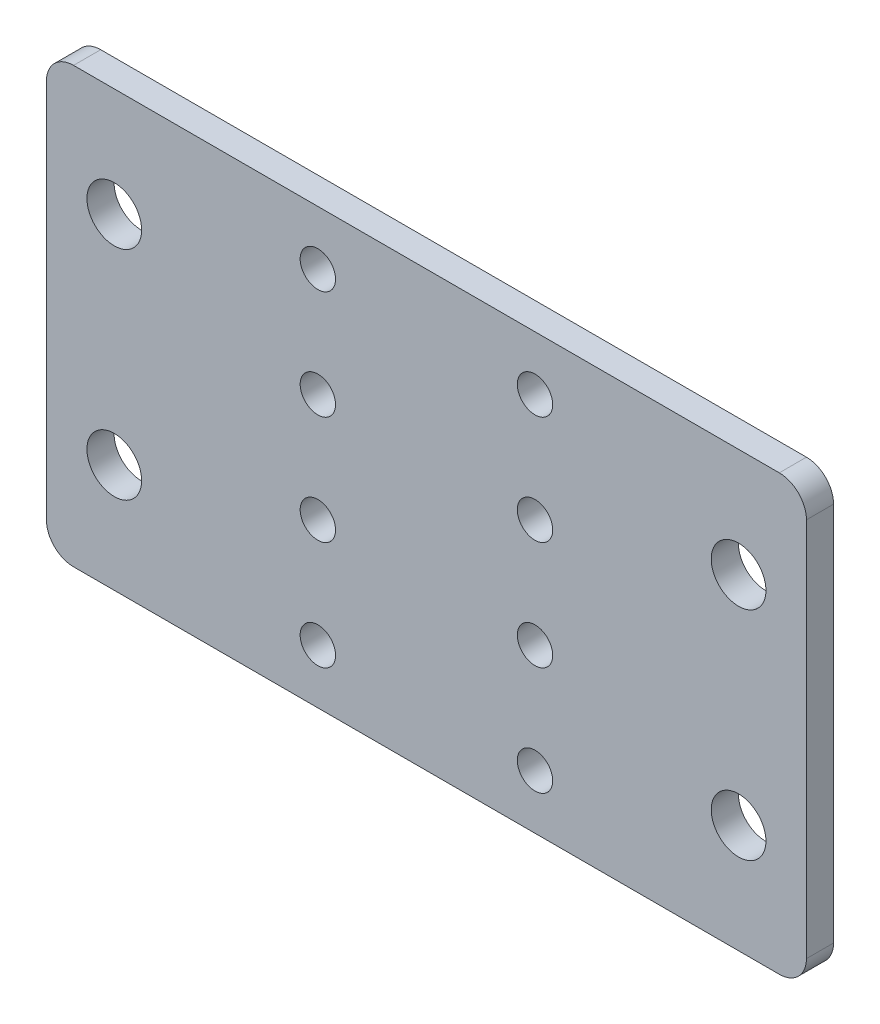
ISO-10303-21;
HEADER;
FILE_DESCRIPTION(('STEP AP214'),'2;1');
FILE_NAME('part.step','',(''),(''),'','','');
FILE_SCHEMA(('AUTOMOTIVE_DESIGN { 1 0 10303 214 1 1 1 1 }'));
ENDSEC;
DATA;
#1=APPLICATION_CONTEXT('core data for automotive mechanical design processes');
#2=APPLICATION_PROTOCOL_DEFINITION('international standard','automotive_design',2000,#1);
#3=PRODUCT_CONTEXT('',#1,'mechanical');
#4=PRODUCT('Part','Part','',(#3));
#5=PRODUCT_RELATED_PRODUCT_CATEGORY('part','',(#4));
#6=PRODUCT_DEFINITION_FORMATION('','',#4);
#7=PRODUCT_DEFINITION_CONTEXT('part definition',#1,'design');
#8=PRODUCT_DEFINITION('design','',#6,#7);
#9=PRODUCT_DEFINITION_SHAPE('','',#8);
#10=(LENGTH_UNIT() NAMED_UNIT(*) SI_UNIT(.MILLI.,.METRE.));
#11=(NAMED_UNIT(*) PLANE_ANGLE_UNIT() SI_UNIT($,.RADIAN.));
#12=(NAMED_UNIT(*) SI_UNIT($,.STERADIAN.) SOLID_ANGLE_UNIT());
#13=UNCERTAINTY_MEASURE_WITH_UNIT(LENGTH_MEASURE(1.E-05),#10,'distance_accuracy_value','');
#14=(GEOMETRIC_REPRESENTATION_CONTEXT(3) GLOBAL_UNCERTAINTY_ASSIGNED_CONTEXT((#13)) GLOBAL_UNIT_ASSIGNED_CONTEXT((#10,
#11,#12)) REPRESENTATION_CONTEXT('',''));
#15=CARTESIAN_POINT('',(0.,0.,0.));
#16=DIRECTION('',(0.,0.,1.));
#17=DIRECTION('',(1.,0.,0.));
#18=AXIS2_PLACEMENT_3D('',#15,#16,#17);
#19=CARTESIAN_POINT('',(25.4,25.4,0.));
#20=DIRECTION('',(0.,0.,1.));
#21=DIRECTION('',(1.,0.,0.));
#22=AXIS2_PLACEMENT_3D('',#19,#20,#21);
#23=PLANE('',#22);
#24=DIRECTION('',(0.,-1.,0.));
#25=VECTOR('',#24,1.);
#26=CARTESIAN_POINT('',(-19.0499999999999,50.8,0.));
#27=LINE('',#26,#25);
#28=CARTESIAN_POINT('',(-19.0499999999999,47.625,0.));
#29=VERTEX_POINT('',#28);
#30=CARTESIAN_POINT('',(-19.05,3.175,0.));
#31=VERTEX_POINT('',#30);
#32=EDGE_CURVE('E84',#29,#31,#27,.T.);
#33=ORIENTED_EDGE('',*,*,#32,.F.);
#34=CARTESIAN_POINT('',(-15.8749999999999,47.625,0.));
#35=DIRECTION('',(0.,0.,1.));
#36=DIRECTION('',(1.,0.,0.));
#37=AXIS2_PLACEMENT_3D('',#34,#35,#36);
#38=CIRCLE('',#37,3.175);
#39=CARTESIAN_POINT('',(-15.8749999999999,50.8,0.));
#40=VERTEX_POINT('',#39);
#41=EDGE_CURVE('E97',#40,#29,#38,.T.);
#42=ORIENTED_EDGE('',*,*,#41,.F.);
#43=DIRECTION('',(1.,0.,0.));
#44=VECTOR('',#43,1.);
#45=CARTESIAN_POINT('',(69.85,50.8,0.));
#46=LINE('',#45,#44);
#47=CARTESIAN_POINT('',(66.675,50.8,0.));
#48=VERTEX_POINT('',#47);
#49=EDGE_CURVE('E109',#48,#40,#46,.F.);
#50=ORIENTED_EDGE('',*,*,#49,.F.);
#51=CARTESIAN_POINT('',(66.675,47.625,0.));
#52=DIRECTION('',(0.,0.,1.));
#53=DIRECTION('',(1.,0.,0.));
#54=AXIS2_PLACEMENT_3D('',#51,#52,#53);
#55=CIRCLE('',#54,3.175);
#56=CARTESIAN_POINT('',(69.85,47.625,0.));
#57=VERTEX_POINT('',#56);
#58=EDGE_CURVE('E198',#57,#48,#55,.T.);
#59=ORIENTED_EDGE('',*,*,#58,.F.);
#60=DIRECTION('',(0.,1.,0.));
#61=VECTOR('',#60,1.);
#62=CARTESIAN_POINT('',(69.85,0.,0.));
#63=LINE('',#62,#61);
#64=CARTESIAN_POINT('',(69.85,3.175,0.));
#65=VERTEX_POINT('',#64);
#66=EDGE_CURVE('E113',#65,#57,#63,.T.);
#67=ORIENTED_EDGE('',*,*,#66,.F.);
#68=CARTESIAN_POINT('',(66.675,3.175,0.));
#69=DIRECTION('',(0.,0.,1.));
#70=DIRECTION('',(1.,0.,0.));
#71=AXIS2_PLACEMENT_3D('',#68,#69,#70);
#72=CIRCLE('',#71,3.175);
#73=CARTESIAN_POINT('',(66.675,0.,0.));
#74=VERTEX_POINT('',#73);
#75=EDGE_CURVE('E199',#74,#65,#72,.T.);
#76=ORIENTED_EDGE('',*,*,#75,.F.);
#77=DIRECTION('',(1.,0.,0.));
#78=VECTOR('',#77,1.);
#79=CARTESIAN_POINT('',(-19.05,0.,0.));
#80=LINE('',#79,#78);
#81=CARTESIAN_POINT('',(-15.875,0.,0.));
#82=VERTEX_POINT('',#81);
#83=EDGE_CURVE('E86',#82,#74,#80,.T.);
#84=ORIENTED_EDGE('',*,*,#83,.F.);
#85=CARTESIAN_POINT('',(-15.875,3.175,0.));
#86=DIRECTION('',(0.,0.,1.));
#87=DIRECTION('',(1.,0.,0.));
#88=AXIS2_PLACEMENT_3D('',#85,#86,#87);
#89=CIRCLE('',#88,3.175);
#90=EDGE_CURVE('E20',#31,#82,#89,.T.);
#91=ORIENTED_EDGE('',*,*,#90,.F.);
#92=EDGE_LOOP('',(#33,#42,#50,#59,#67,#76,#84,#91));
#93=FACE_BOUND('',#92,.T.);
#94=CARTESIAN_POINT('',(12.7,6.35,0.));
#95=DIRECTION('',(0.,0.,1.));
#96=DIRECTION('',(1.,0.,0.));
#97=AXIS2_PLACEMENT_3D('',#94,#95,#96);
#98=CIRCLE('',#97,2.0701);
#99=CARTESIAN_POINT('',(14.7701,6.35,0.));
#100=VERTEX_POINT('',#99);
#101=EDGE_CURVE('E165',#100,#100,#98,.T.);
#102=ORIENTED_EDGE('',*,*,#101,.T.);
#103=EDGE_LOOP('',(#102));
#104=FACE_BOUND('',#103,.T.);
#105=CARTESIAN_POINT('',(12.7,44.45,0.));
#106=DIRECTION('',(0.,0.,1.));
#107=DIRECTION('',(1.,0.,0.));
#108=AXIS2_PLACEMENT_3D('',#105,#106,#107);
#109=CIRCLE('',#108,2.0701);
#110=CARTESIAN_POINT('',(14.7701,44.45,0.));
#111=VERTEX_POINT('',#110);
#112=EDGE_CURVE('E168',#111,#111,#109,.T.);
#113=ORIENTED_EDGE('',*,*,#112,.T.);
#114=EDGE_LOOP('',(#113));
#115=FACE_BOUND('',#114,.T.);
#116=CARTESIAN_POINT('',(38.1,31.75,0.));
#117=DIRECTION('',(0.,0.,1.));
#118=DIRECTION('',(1.,0.,0.));
#119=AXIS2_PLACEMENT_3D('',#116,#117,#118);
#120=CIRCLE('',#119,2.0701);
#121=CARTESIAN_POINT('',(40.1701,31.75,0.));
#122=VERTEX_POINT('',#121);
#123=EDGE_CURVE('E171',#122,#122,#120,.T.);
#124=ORIENTED_EDGE('',*,*,#123,.T.);
#125=EDGE_LOOP('',(#124));
#126=FACE_BOUND('',#125,.T.);
#127=CARTESIAN_POINT('',(38.1,6.35,0.));
#128=DIRECTION('',(0.,0.,1.));
#129=DIRECTION('',(1.,0.,0.));
#130=AXIS2_PLACEMENT_3D('',#127,#128,#129);
#131=CIRCLE('',#130,2.0701);
#132=CARTESIAN_POINT('',(40.1701,6.35,0.));
#133=VERTEX_POINT('',#132);
#134=EDGE_CURVE('E174',#133,#133,#131,.T.);
#135=ORIENTED_EDGE('',*,*,#134,.T.);
#136=EDGE_LOOP('',(#135));
#137=FACE_BOUND('',#136,.T.);
#138=CARTESIAN_POINT('',(38.1,44.45,0.));
#139=DIRECTION('',(0.,0.,1.));
#140=DIRECTION('',(1.,0.,0.));
#141=AXIS2_PLACEMENT_3D('',#138,#139,#140);
#142=CIRCLE('',#141,2.0701);
#143=CARTESIAN_POINT('',(40.1701,44.45,0.));
#144=VERTEX_POINT('',#143);
#145=EDGE_CURVE('E177',#144,#144,#142,.T.);
#146=ORIENTED_EDGE('',*,*,#145,.T.);
#147=EDGE_LOOP('',(#146));
#148=FACE_BOUND('',#147,.T.);
#149=CARTESIAN_POINT('',(12.7,31.75,0.));
#150=DIRECTION('',(0.,0.,1.));
#151=DIRECTION('',(1.,0.,0.));
#152=AXIS2_PLACEMENT_3D('',#149,#150,#151);
#153=CIRCLE('',#152,2.0701);
#154=CARTESIAN_POINT('',(14.7701,31.75,0.));
#155=VERTEX_POINT('',#154);
#156=EDGE_CURVE('E180',#155,#155,#153,.T.);
#157=ORIENTED_EDGE('',*,*,#156,.T.);
#158=EDGE_LOOP('',(#157));
#159=FACE_BOUND('',#158,.T.);
#160=CARTESIAN_POINT('',(12.7,19.05,0.));
#161=DIRECTION('',(0.,0.,1.));
#162=DIRECTION('',(1.,0.,0.));
#163=AXIS2_PLACEMENT_3D('',#160,#161,#162);
#164=CIRCLE('',#163,2.0701);
#165=CARTESIAN_POINT('',(14.7701,19.05,0.));
#166=VERTEX_POINT('',#165);
#167=EDGE_CURVE('E183',#166,#166,#164,.T.);
#168=ORIENTED_EDGE('',*,*,#167,.T.);
#169=EDGE_LOOP('',(#168));
#170=FACE_BOUND('',#169,.T.);
#171=CARTESIAN_POINT('',(38.1,19.05,0.));
#172=DIRECTION('',(0.,0.,1.));
#173=DIRECTION('',(1.,0.,0.));
#174=AXIS2_PLACEMENT_3D('',#171,#172,#173);
#175=CIRCLE('',#174,2.0701);
#176=CARTESIAN_POINT('',(40.1701,19.05,0.));
#177=VERTEX_POINT('',#176);
#178=EDGE_CURVE('E186',#177,#177,#175,.T.);
#179=ORIENTED_EDGE('',*,*,#178,.T.);
#180=EDGE_LOOP('',(#179));
#181=FACE_BOUND('',#180,.T.);
#182=CARTESIAN_POINT('',(-11.1125,38.1,0.));
#183=DIRECTION('',(0.,0.,1.));
#184=DIRECTION('',(1.,0.,0.));
#185=AXIS2_PLACEMENT_3D('',#182,#183,#184);
#186=CIRCLE('',#185,3.2004);
#187=CARTESIAN_POINT('',(-7.91209999999997,38.1,0.));
#188=VERTEX_POINT('',#187);
#189=EDGE_CURVE('E189',#188,#188,#186,.T.);
#190=ORIENTED_EDGE('',*,*,#189,.T.);
#191=EDGE_LOOP('',(#190));
#192=FACE_BOUND('',#191,.T.);
#193=CARTESIAN_POINT('',(61.9125,38.1,0.));
#194=DIRECTION('',(0.,0.,1.));
#195=DIRECTION('',(1.,0.,0.));
#196=AXIS2_PLACEMENT_3D('',#193,#194,#195);
#197=CIRCLE('',#196,3.2004);
#198=CARTESIAN_POINT('',(65.1129,38.1,0.));
#199=VERTEX_POINT('',#198);
#200=EDGE_CURVE('E192',#199,#199,#197,.T.);
#201=ORIENTED_EDGE('',*,*,#200,.T.);
#202=EDGE_LOOP('',(#201));
#203=FACE_BOUND('',#202,.T.);
#204=CARTESIAN_POINT('',(-11.1125,12.7,0.));
#205=DIRECTION('',(0.,0.,1.));
#206=DIRECTION('',(1.,0.,0.));
#207=AXIS2_PLACEMENT_3D('',#204,#205,#206);
#208=CIRCLE('',#207,3.2004);
#209=CARTESIAN_POINT('',(-7.91210000000003,12.7,0.));
#210=VERTEX_POINT('',#209);
#211=EDGE_CURVE('E103',#210,#210,#208,.T.);
#212=ORIENTED_EDGE('',*,*,#211,.T.);
#213=EDGE_LOOP('',(#212));
#214=FACE_BOUND('',#213,.T.);
#215=CARTESIAN_POINT('',(61.9125,12.7,0.));
#216=DIRECTION('',(0.,0.,1.));
#217=DIRECTION('',(1.,0.,0.));
#218=AXIS2_PLACEMENT_3D('',#215,#216,#217);
#219=CIRCLE('',#218,3.2004);
#220=CARTESIAN_POINT('',(65.1129,12.7,0.));
#221=VERTEX_POINT('',#220);
#222=EDGE_CURVE('E100',#221,#221,#219,.T.);
#223=ORIENTED_EDGE('',*,*,#222,.T.);
#224=EDGE_LOOP('',(#223));
#225=FACE_BOUND('',#224,.T.);
#226=ADVANCED_FACE('F17',(#93,#104,#115,#126,#137,#148,#159,#170,#181,#192,#203,#214,#225),#23,.F.);
#227=CARTESIAN_POINT('',(-15.875,3.175,0.));
#228=DIRECTION('',(0.,0.,1.));
#229=DIRECTION('',(1.,0.,0.));
#230=AXIS2_PLACEMENT_3D('',#227,#228,#229);
#231=CYLINDRICAL_SURFACE('',#230,3.175);
#232=ORIENTED_EDGE('',*,*,#90,.T.);
#233=DIRECTION('',(0.,0.,-1.));
#234=VECTOR('',#233,1.);
#235=CARTESIAN_POINT('',(-15.875,0.,0.));
#236=LINE('',#235,#234);
#237=CARTESIAN_POINT('',(-15.875,0.,3.175));
#238=VERTEX_POINT('',#237);
#239=EDGE_CURVE('E89',#238,#82,#236,.T.);
#240=ORIENTED_EDGE('',*,*,#239,.F.);
#241=CARTESIAN_POINT('',(-15.875,3.175,3.175));
#242=DIRECTION('',(0.,0.,1.));
#243=DIRECTION('',(1.,0.,0.));
#244=AXIS2_PLACEMENT_3D('',#241,#242,#243);
#245=CIRCLE('',#244,3.175);
#246=CARTESIAN_POINT('',(-19.05,3.175,3.175));
#247=VERTEX_POINT('',#246);
#248=EDGE_CURVE('E94',#247,#238,#245,.T.);
#249=ORIENTED_EDGE('',*,*,#248,.F.);
#250=DIRECTION('',(0.,0.,1.));
#251=VECTOR('',#250,1.);
#252=CARTESIAN_POINT('',(-19.05,3.175,0.));
#253=LINE('',#252,#251);
#254=EDGE_CURVE('E91',#31,#247,#253,.T.);
#255=ORIENTED_EDGE('',*,*,#254,.F.);
#256=EDGE_LOOP('',(#232,#240,#249,#255));
#257=FACE_BOUND('',#256,.T.);
#258=ADVANCED_FACE('F92',(#257),#231,.T.);
#259=CARTESIAN_POINT('',(-19.05,0.,0.));
#260=DIRECTION('',(0.,-1.,0.));
#261=DIRECTION('',(0.,0.,-1.));
#262=AXIS2_PLACEMENT_3D('',#259,#260,#261);
#263=PLANE('',#262);
#264=DIRECTION('',(0.,0.,1.));
#265=VECTOR('',#264,1.);
#266=CARTESIAN_POINT('',(66.675,0.,0.));
#267=LINE('',#266,#265);
#268=CARTESIAN_POINT('',(66.675,0.,3.175));
#269=VERTEX_POINT('',#268);
#270=EDGE_CURVE('E117',#269,#74,#267,.F.);
#271=ORIENTED_EDGE('',*,*,#270,.F.);
#272=DIRECTION('',(1.,0.,0.));
#273=VECTOR('',#272,1.);
#274=CARTESIAN_POINT('',(25.4,0.,3.175));
#275=LINE('',#274,#273);
#276=EDGE_CURVE('E163',#238,#269,#275,.T.);
#277=ORIENTED_EDGE('',*,*,#276,.F.);
#278=ORIENTED_EDGE('',*,*,#239,.T.);
#279=ORIENTED_EDGE('',*,*,#83,.T.);
#280=EDGE_LOOP('',(#271,#277,#278,#279));
#281=FACE_BOUND('',#280,.T.);
#282=ADVANCED_FACE('F236',(#281),#263,.T.);
#283=CARTESIAN_POINT('',(66.675,3.175,0.));
#284=DIRECTION('',(0.,0.,1.));
#285=DIRECTION('',(1.,0.,0.));
#286=AXIS2_PLACEMENT_3D('',#283,#284,#285);
#287=CYLINDRICAL_SURFACE('',#286,3.175);
#288=ORIENTED_EDGE('',*,*,#75,.T.);
#289=DIRECTION('',(0.,0.,-1.));
#290=VECTOR('',#289,1.);
#291=CARTESIAN_POINT('',(69.85,3.175,0.));
#292=LINE('',#291,#290);
#293=CARTESIAN_POINT('',(69.85,3.175,3.175));
#294=VERTEX_POINT('',#293);
#295=EDGE_CURVE('E116',#294,#65,#292,.T.);
#296=ORIENTED_EDGE('',*,*,#295,.F.);
#297=CARTESIAN_POINT('',(66.675,3.175,3.175));
#298=DIRECTION('',(0.,0.,1.));
#299=DIRECTION('',(1.,0.,0.));
#300=AXIS2_PLACEMENT_3D('',#297,#298,#299);
#301=CIRCLE('',#300,3.175);
#302=EDGE_CURVE('E160',#269,#294,#301,.T.);
#303=ORIENTED_EDGE('',*,*,#302,.F.);
#304=ORIENTED_EDGE('',*,*,#270,.T.);
#305=EDGE_LOOP('',(#288,#296,#303,#304));
#306=FACE_BOUND('',#305,.T.);
#307=ADVANCED_FACE('F233',(#306),#287,.T.);
#308=CARTESIAN_POINT('',(69.85,0.,0.));
#309=DIRECTION('',(1.,0.,0.));
#310=DIRECTION('',(0.,0.,-1.));
#311=AXIS2_PLACEMENT_3D('',#308,#309,#310);
#312=PLANE('',#311);
#313=DIRECTION('',(0.,0.,1.));
#314=VECTOR('',#313,1.);
#315=CARTESIAN_POINT('',(69.85,47.625,0.));
#316=LINE('',#315,#314);
#317=CARTESIAN_POINT('',(69.85,47.625,3.175));
#318=VERTEX_POINT('',#317);
#319=EDGE_CURVE('E115',#318,#57,#316,.F.);
#320=ORIENTED_EDGE('',*,*,#319,.F.);
#321=DIRECTION('',(0.,1.,0.));
#322=VECTOR('',#321,1.);
#323=CARTESIAN_POINT('',(69.85,25.4,3.175));
#324=LINE('',#323,#322);
#325=EDGE_CURVE('E159',#294,#318,#324,.T.);
#326=ORIENTED_EDGE('',*,*,#325,.F.);
#327=ORIENTED_EDGE('',*,*,#295,.T.);
#328=ORIENTED_EDGE('',*,*,#66,.T.);
#329=EDGE_LOOP('',(#320,#326,#327,#328));
#330=FACE_BOUND('',#329,.T.);
#331=ADVANCED_FACE('F232',(#330),#312,.T.);
#332=CARTESIAN_POINT('',(66.675,47.625,0.));
#333=DIRECTION('',(0.,0.,1.));
#334=DIRECTION('',(1.,0.,0.));
#335=AXIS2_PLACEMENT_3D('',#332,#333,#334);
#336=CYLINDRICAL_SURFACE('',#335,3.175);
#337=ORIENTED_EDGE('',*,*,#58,.T.);
#338=DIRECTION('',(0.,0.,1.));
#339=VECTOR('',#338,1.);
#340=CARTESIAN_POINT('',(66.675,50.8,0.));
#341=LINE('',#340,#339);
#342=CARTESIAN_POINT('',(66.675,50.8,3.175));
#343=VERTEX_POINT('',#342);
#344=EDGE_CURVE('E112',#343,#48,#341,.F.);
#345=ORIENTED_EDGE('',*,*,#344,.F.);
#346=CARTESIAN_POINT('',(66.675,47.625,3.175));
#347=DIRECTION('',(0.,0.,1.));
#348=DIRECTION('',(1.,0.,0.));
#349=AXIS2_PLACEMENT_3D('',#346,#347,#348);
#350=CIRCLE('',#349,3.175);
#351=EDGE_CURVE('E156',#318,#343,#350,.T.);
#352=ORIENTED_EDGE('',*,*,#351,.F.);
#353=ORIENTED_EDGE('',*,*,#319,.T.);
#354=EDGE_LOOP('',(#337,#345,#352,#353));
#355=FACE_BOUND('',#354,.T.);
#356=ADVANCED_FACE('F229',(#355),#336,.T.);
#357=CARTESIAN_POINT('',(69.85,50.8,0.));
#358=DIRECTION('',(0.,1.,0.));
#359=DIRECTION('',(0.,0.,1.));
#360=AXIS2_PLACEMENT_3D('',#357,#358,#359);
#361=PLANE('',#360);
#362=ORIENTED_EDGE('',*,*,#344,.T.);
#363=ORIENTED_EDGE('',*,*,#49,.T.);
#364=DIRECTION('',(0.,0.,1.));
#365=VECTOR('',#364,1.);
#366=CARTESIAN_POINT('',(-15.8749999999999,50.8,0.));
#367=LINE('',#366,#365);
#368=CARTESIAN_POINT('',(-15.8749999999999,50.8,3.175));
#369=VERTEX_POINT('',#368);
#370=EDGE_CURVE('E111',#369,#40,#367,.F.);
#371=ORIENTED_EDGE('',*,*,#370,.F.);
#372=DIRECTION('',(1.,0.,0.));
#373=VECTOR('',#372,1.);
#374=CARTESIAN_POINT('',(25.4,50.8,3.175));
#375=LINE('',#374,#373);
#376=EDGE_CURVE('E155',#343,#369,#375,.F.);
#377=ORIENTED_EDGE('',*,*,#376,.F.);
#378=EDGE_LOOP('',(#362,#363,#371,#377));
#379=FACE_BOUND('',#378,.T.);
#380=ADVANCED_FACE('F224',(#379),#361,.T.);
#381=CARTESIAN_POINT('',(-15.8749999999999,47.625,0.));
#382=DIRECTION('',(0.,0.,1.));
#383=DIRECTION('',(1.,0.,0.));
#384=AXIS2_PLACEMENT_3D('',#381,#382,#383);
#385=CYLINDRICAL_SURFACE('',#384,3.175);
#386=ORIENTED_EDGE('',*,*,#41,.T.);
#387=DIRECTION('',(0.,0.,1.));
#388=VECTOR('',#387,1.);
#389=CARTESIAN_POINT('',(-19.0499999999999,47.625,0.));
#390=LINE('',#389,#388);
#391=CARTESIAN_POINT('',(-19.0499999999999,47.625,3.175));
#392=VERTEX_POINT('',#391);
#393=EDGE_CURVE('E35',#392,#29,#390,.F.);
#394=ORIENTED_EDGE('',*,*,#393,.F.);
#395=CARTESIAN_POINT('',(-15.8749999999999,47.625,3.175));
#396=DIRECTION('',(0.,0.,1.));
#397=DIRECTION('',(1.,0.,0.));
#398=AXIS2_PLACEMENT_3D('',#395,#396,#397);
#399=CIRCLE('',#398,3.175);
#400=EDGE_CURVE('E152',#369,#392,#399,.T.);
#401=ORIENTED_EDGE('',*,*,#400,.F.);
#402=ORIENTED_EDGE('',*,*,#370,.T.);
#403=EDGE_LOOP('',(#386,#394,#401,#402));
#404=FACE_BOUND('',#403,.T.);
#405=ADVANCED_FACE('F222',(#404),#385,.T.);
#406=CARTESIAN_POINT('',(-19.0499999999999,50.8,0.));
#407=DIRECTION('',(-1.,0.,0.));
#408=DIRECTION('',(0.,-1.,0.));
#409=AXIS2_PLACEMENT_3D('',#406,#407,#408);
#410=PLANE('',#409);
#411=ORIENTED_EDGE('',*,*,#393,.T.);
#412=ORIENTED_EDGE('',*,*,#32,.T.);
#413=ORIENTED_EDGE('',*,*,#254,.T.);
#414=DIRECTION('',(0.,1.,0.));
#415=VECTOR('',#414,1.);
#416=CARTESIAN_POINT('',(-19.0499999999999,25.4,3.175));
#417=LINE('',#416,#415);
#418=EDGE_CURVE('E151',#392,#247,#417,.F.);
#419=ORIENTED_EDGE('',*,*,#418,.F.);
#420=EDGE_LOOP('',(#411,#412,#413,#419));
#421=FACE_BOUND('',#420,.T.);
#422=ADVANCED_FACE('F99',(#421),#410,.T.);
#423=CARTESIAN_POINT('',(61.9125,12.7,0.));
#424=DIRECTION('',(0.,0.,1.));
#425=DIRECTION('',(1.,0.,0.));
#426=AXIS2_PLACEMENT_3D('',#423,#424,#425);
#427=CYLINDRICAL_SURFACE('',#426,3.2004);
#428=ORIENTED_EDGE('',*,*,#222,.F.);
#429=EDGE_LOOP('',(#428));
#430=FACE_BOUND('',#429,.T.);
#431=CARTESIAN_POINT('',(61.9125,12.7,3.175));
#432=DIRECTION('',(0.,0.,1.));
#433=DIRECTION('',(1.,0.,0.));
#434=AXIS2_PLACEMENT_3D('',#431,#432,#433);
#435=CIRCLE('',#434,3.2004);
#436=CARTESIAN_POINT('',(65.1129,12.7,3.175));
#437=VERTEX_POINT('',#436);
#438=EDGE_CURVE('E148',#437,#437,#435,.F.);
#439=ORIENTED_EDGE('',*,*,#438,.F.);
#440=EDGE_LOOP('',(#439));
#441=FACE_BOUND('',#440,.T.);
#442=ADVANCED_FACE('F295',(#430,#441),#427,.F.);
#443=CARTESIAN_POINT('',(-11.1125,12.7,0.));
#444=DIRECTION('',(0.,0.,1.));
#445=DIRECTION('',(1.,0.,0.));
#446=AXIS2_PLACEMENT_3D('',#443,#444,#445);
#447=CYLINDRICAL_SURFACE('',#446,3.2004);
#448=ORIENTED_EDGE('',*,*,#211,.F.);
#449=EDGE_LOOP('',(#448));
#450=FACE_BOUND('',#449,.T.);
#451=CARTESIAN_POINT('',(-11.1125,12.7,3.175));
#452=DIRECTION('',(0.,0.,1.));
#453=DIRECTION('',(1.,0.,0.));
#454=AXIS2_PLACEMENT_3D('',#451,#452,#453);
#455=CIRCLE('',#454,3.2004);
#456=CARTESIAN_POINT('',(-7.91210000000003,12.7,3.175));
#457=VERTEX_POINT('',#456);
#458=EDGE_CURVE('E145',#457,#457,#455,.F.);
#459=ORIENTED_EDGE('',*,*,#458,.F.);
#460=EDGE_LOOP('',(#459));
#461=FACE_BOUND('',#460,.T.);
#462=ADVANCED_FACE('F291',(#450,#461),#447,.F.);
#463=CARTESIAN_POINT('',(61.9125,38.1,0.));
#464=DIRECTION('',(0.,0.,1.));
#465=DIRECTION('',(1.,0.,0.));
#466=AXIS2_PLACEMENT_3D('',#463,#464,#465);
#467=CYLINDRICAL_SURFACE('',#466,3.2004);
#468=ORIENTED_EDGE('',*,*,#200,.F.);
#469=EDGE_LOOP('',(#468));
#470=FACE_BOUND('',#469,.T.);
#471=CARTESIAN_POINT('',(61.9125,38.1,3.175));
#472=DIRECTION('',(0.,0.,1.));
#473=DIRECTION('',(1.,0.,0.));
#474=AXIS2_PLACEMENT_3D('',#471,#472,#473);
#475=CIRCLE('',#474,3.2004);
#476=CARTESIAN_POINT('',(65.1129,38.1,3.175));
#477=VERTEX_POINT('',#476);
#478=EDGE_CURVE('E142',#477,#477,#475,.F.);
#479=ORIENTED_EDGE('',*,*,#478,.F.);
#480=EDGE_LOOP('',(#479));
#481=FACE_BOUND('',#480,.T.);
#482=ADVANCED_FACE('F287',(#470,#481),#467,.F.);
#483=CARTESIAN_POINT('',(-11.1125,38.1,0.));
#484=DIRECTION('',(0.,0.,1.));
#485=DIRECTION('',(1.,0.,0.));
#486=AXIS2_PLACEMENT_3D('',#483,#484,#485);
#487=CYLINDRICAL_SURFACE('',#486,3.2004);
#488=ORIENTED_EDGE('',*,*,#189,.F.);
#489=EDGE_LOOP('',(#488));
#490=FACE_BOUND('',#489,.T.);
#491=CARTESIAN_POINT('',(-11.1125,38.1,3.175));
#492=DIRECTION('',(0.,0.,1.));
#493=DIRECTION('',(1.,0.,0.));
#494=AXIS2_PLACEMENT_3D('',#491,#492,#493);
#495=CIRCLE('',#494,3.2004);
#496=CARTESIAN_POINT('',(-7.91209999999997,38.1,3.175));
#497=VERTEX_POINT('',#496);
#498=EDGE_CURVE('E139',#497,#497,#495,.F.);
#499=ORIENTED_EDGE('',*,*,#498,.F.);
#500=EDGE_LOOP('',(#499));
#501=FACE_BOUND('',#500,.T.);
#502=ADVANCED_FACE('F283',(#490,#501),#487,.F.);
#503=CARTESIAN_POINT('',(38.1,19.05,0.));
#504=DIRECTION('',(0.,0.,1.));
#505=DIRECTION('',(1.,0.,0.));
#506=AXIS2_PLACEMENT_3D('',#503,#504,#505);
#507=CYLINDRICAL_SURFACE('',#506,2.0701);
#508=ORIENTED_EDGE('',*,*,#178,.F.);
#509=EDGE_LOOP('',(#508));
#510=FACE_BOUND('',#509,.T.);
#511=CARTESIAN_POINT('',(38.1,19.05,3.175));
#512=DIRECTION('',(0.,0.,1.));
#513=DIRECTION('',(1.,0.,0.));
#514=AXIS2_PLACEMENT_3D('',#511,#512,#513);
#515=CIRCLE('',#514,2.0701);
#516=CARTESIAN_POINT('',(40.1701,19.05,3.175));
#517=VERTEX_POINT('',#516);
#518=EDGE_CURVE('E136',#517,#517,#515,.F.);
#519=ORIENTED_EDGE('',*,*,#518,.F.);
#520=EDGE_LOOP('',(#519));
#521=FACE_BOUND('',#520,.T.);
#522=ADVANCED_FACE('F279',(#510,#521),#507,.F.);
#523=CARTESIAN_POINT('',(12.7,19.05,0.));
#524=DIRECTION('',(0.,0.,1.));
#525=DIRECTION('',(1.,0.,0.));
#526=AXIS2_PLACEMENT_3D('',#523,#524,#525);
#527=CYLINDRICAL_SURFACE('',#526,2.0701);
#528=ORIENTED_EDGE('',*,*,#167,.F.);
#529=EDGE_LOOP('',(#528));
#530=FACE_BOUND('',#529,.T.);
#531=CARTESIAN_POINT('',(12.7,19.05,3.175));
#532=DIRECTION('',(0.,0.,1.));
#533=DIRECTION('',(1.,0.,0.));
#534=AXIS2_PLACEMENT_3D('',#531,#532,#533);
#535=CIRCLE('',#534,2.0701);
#536=CARTESIAN_POINT('',(14.7701,19.05,3.175));
#537=VERTEX_POINT('',#536);
#538=EDGE_CURVE('E133',#537,#537,#535,.F.);
#539=ORIENTED_EDGE('',*,*,#538,.F.);
#540=EDGE_LOOP('',(#539));
#541=FACE_BOUND('',#540,.T.);
#542=ADVANCED_FACE('F275',(#530,#541),#527,.F.);
#543=CARTESIAN_POINT('',(12.7,31.75,0.));
#544=DIRECTION('',(0.,0.,1.));
#545=DIRECTION('',(1.,0.,0.));
#546=AXIS2_PLACEMENT_3D('',#543,#544,#545);
#547=CYLINDRICAL_SURFACE('',#546,2.0701);
#548=ORIENTED_EDGE('',*,*,#156,.F.);
#549=EDGE_LOOP('',(#548));
#550=FACE_BOUND('',#549,.T.);
#551=CARTESIAN_POINT('',(12.7,31.75,3.175));
#552=DIRECTION('',(0.,0.,1.));
#553=DIRECTION('',(1.,0.,0.));
#554=AXIS2_PLACEMENT_3D('',#551,#552,#553);
#555=CIRCLE('',#554,2.0701);
#556=CARTESIAN_POINT('',(14.7701,31.75,3.175));
#557=VERTEX_POINT('',#556);
#558=EDGE_CURVE('E130',#557,#557,#555,.F.);
#559=ORIENTED_EDGE('',*,*,#558,.F.);
#560=EDGE_LOOP('',(#559));
#561=FACE_BOUND('',#560,.T.);
#562=ADVANCED_FACE('F271',(#550,#561),#547,.F.);
#563=CARTESIAN_POINT('',(38.1,44.45,0.));
#564=DIRECTION('',(0.,0.,1.));
#565=DIRECTION('',(1.,0.,0.));
#566=AXIS2_PLACEMENT_3D('',#563,#564,#565);
#567=CYLINDRICAL_SURFACE('',#566,2.0701);
#568=ORIENTED_EDGE('',*,*,#145,.F.);
#569=EDGE_LOOP('',(#568));
#570=FACE_BOUND('',#569,.T.);
#571=CARTESIAN_POINT('',(38.1,44.45,3.175));
#572=DIRECTION('',(0.,0.,1.));
#573=DIRECTION('',(1.,0.,0.));
#574=AXIS2_PLACEMENT_3D('',#571,#572,#573);
#575=CIRCLE('',#574,2.0701);
#576=CARTESIAN_POINT('',(40.1701,44.45,3.175));
#577=VERTEX_POINT('',#576);
#578=EDGE_CURVE('E127',#577,#577,#575,.F.);
#579=ORIENTED_EDGE('',*,*,#578,.F.);
#580=EDGE_LOOP('',(#579));
#581=FACE_BOUND('',#580,.T.);
#582=ADVANCED_FACE('F267',(#570,#581),#567,.F.);
#583=CARTESIAN_POINT('',(38.1,6.35,0.));
#584=DIRECTION('',(0.,0.,1.));
#585=DIRECTION('',(1.,0.,0.));
#586=AXIS2_PLACEMENT_3D('',#583,#584,#585);
#587=CYLINDRICAL_SURFACE('',#586,2.0701);
#588=ORIENTED_EDGE('',*,*,#134,.F.);
#589=EDGE_LOOP('',(#588));
#590=FACE_BOUND('',#589,.T.);
#591=CARTESIAN_POINT('',(38.1,6.35,3.175));
#592=DIRECTION('',(0.,0.,1.));
#593=DIRECTION('',(1.,0.,0.));
#594=AXIS2_PLACEMENT_3D('',#591,#592,#593);
#595=CIRCLE('',#594,2.0701);
#596=CARTESIAN_POINT('',(40.1701,6.35,3.175));
#597=VERTEX_POINT('',#596);
#598=EDGE_CURVE('E124',#597,#597,#595,.F.);
#599=ORIENTED_EDGE('',*,*,#598,.F.);
#600=EDGE_LOOP('',(#599));
#601=FACE_BOUND('',#600,.T.);
#602=ADVANCED_FACE('F263',(#590,#601),#587,.F.);
#603=CARTESIAN_POINT('',(38.1,31.75,0.));
#604=DIRECTION('',(0.,0.,1.));
#605=DIRECTION('',(1.,0.,0.));
#606=AXIS2_PLACEMENT_3D('',#603,#604,#605);
#607=CYLINDRICAL_SURFACE('',#606,2.0701);
#608=ORIENTED_EDGE('',*,*,#123,.F.);
#609=EDGE_LOOP('',(#608));
#610=FACE_BOUND('',#609,.T.);
#611=CARTESIAN_POINT('',(38.1,31.75,3.175));
#612=DIRECTION('',(0.,0.,1.));
#613=DIRECTION('',(1.,0.,0.));
#614=AXIS2_PLACEMENT_3D('',#611,#612,#613);
#615=CIRCLE('',#614,2.0701);
#616=CARTESIAN_POINT('',(40.1701,31.75,3.175));
#617=VERTEX_POINT('',#616);
#618=EDGE_CURVE('E121',#617,#617,#615,.F.);
#619=ORIENTED_EDGE('',*,*,#618,.F.);
#620=EDGE_LOOP('',(#619));
#621=FACE_BOUND('',#620,.T.);
#622=ADVANCED_FACE('F259',(#610,#621),#607,.F.);
#623=CARTESIAN_POINT('',(12.7,44.45,0.));
#624=DIRECTION('',(0.,0.,1.));
#625=DIRECTION('',(1.,0.,0.));
#626=AXIS2_PLACEMENT_3D('',#623,#624,#625);
#627=CYLINDRICAL_SURFACE('',#626,2.0701);
#628=ORIENTED_EDGE('',*,*,#112,.F.);
#629=EDGE_LOOP('',(#628));
#630=FACE_BOUND('',#629,.T.);
#631=CARTESIAN_POINT('',(12.7,44.45,3.175));
#632=DIRECTION('',(0.,0.,1.));
#633=DIRECTION('',(1.,0.,0.));
#634=AXIS2_PLACEMENT_3D('',#631,#632,#633);
#635=CIRCLE('',#634,2.0701);
#636=CARTESIAN_POINT('',(14.7701,44.45,3.175));
#637=VERTEX_POINT('',#636);
#638=EDGE_CURVE('E26',#637,#637,#635,.F.);
#639=ORIENTED_EDGE('',*,*,#638,.F.);
#640=EDGE_LOOP('',(#639));
#641=FACE_BOUND('',#640,.T.);
#642=ADVANCED_FACE('F252',(#630,#641),#627,.F.);
#643=CARTESIAN_POINT('',(12.7,6.35,0.));
#644=DIRECTION('',(0.,0.,1.));
#645=DIRECTION('',(1.,0.,0.));
#646=AXIS2_PLACEMENT_3D('',#643,#644,#645);
#647=CYLINDRICAL_SURFACE('',#646,2.0701);
#648=ORIENTED_EDGE('',*,*,#101,.F.);
#649=EDGE_LOOP('',(#648));
#650=FACE_BOUND('',#649,.T.);
#651=CARTESIAN_POINT('',(12.7,6.35,3.175));
#652=DIRECTION('',(0.,0.,1.));
#653=DIRECTION('',(1.,0.,0.));
#654=AXIS2_PLACEMENT_3D('',#651,#652,#653);
#655=CIRCLE('',#654,2.0701);
#656=CARTESIAN_POINT('',(14.7701,6.35,3.175));
#657=VERTEX_POINT('',#656);
#658=EDGE_CURVE('E11',#657,#657,#655,.F.);
#659=ORIENTED_EDGE('',*,*,#658,.F.);
#660=EDGE_LOOP('',(#659));
#661=FACE_BOUND('',#660,.T.);
#662=ADVANCED_FACE('F246',(#650,#661),#647,.F.);
#663=CARTESIAN_POINT('',(25.4,25.4,3.175));
#664=DIRECTION('',(0.,0.,1.));
#665=DIRECTION('',(1.,0.,0.));
#666=AXIS2_PLACEMENT_3D('',#663,#664,#665);
#667=PLANE('',#666);
#668=ORIENTED_EDGE('',*,*,#658,.T.);
#669=EDGE_LOOP('',(#668));
#670=FACE_BOUND('',#669,.T.);
#671=ORIENTED_EDGE('',*,*,#638,.T.);
#672=EDGE_LOOP('',(#671));
#673=FACE_BOUND('',#672,.T.);
#674=ORIENTED_EDGE('',*,*,#618,.T.);
#675=EDGE_LOOP('',(#674));
#676=FACE_BOUND('',#675,.T.);
#677=ORIENTED_EDGE('',*,*,#598,.T.);
#678=EDGE_LOOP('',(#677));
#679=FACE_BOUND('',#678,.T.);
#680=ORIENTED_EDGE('',*,*,#578,.T.);
#681=EDGE_LOOP('',(#680));
#682=FACE_BOUND('',#681,.T.);
#683=ORIENTED_EDGE('',*,*,#558,.T.);
#684=EDGE_LOOP('',(#683));
#685=FACE_BOUND('',#684,.T.);
#686=ORIENTED_EDGE('',*,*,#538,.T.);
#687=EDGE_LOOP('',(#686));
#688=FACE_BOUND('',#687,.T.);
#689=ORIENTED_EDGE('',*,*,#518,.T.);
#690=EDGE_LOOP('',(#689));
#691=FACE_BOUND('',#690,.T.);
#692=ORIENTED_EDGE('',*,*,#498,.T.);
#693=EDGE_LOOP('',(#692));
#694=FACE_BOUND('',#693,.T.);
#695=ORIENTED_EDGE('',*,*,#478,.T.);
#696=EDGE_LOOP('',(#695));
#697=FACE_BOUND('',#696,.T.);
#698=ORIENTED_EDGE('',*,*,#458,.T.);
#699=EDGE_LOOP('',(#698));
#700=FACE_BOUND('',#699,.T.);
#701=ORIENTED_EDGE('',*,*,#438,.T.);
#702=EDGE_LOOP('',(#701));
#703=FACE_BOUND('',#702,.T.);
#704=ORIENTED_EDGE('',*,*,#400,.T.);
#705=ORIENTED_EDGE('',*,*,#418,.T.);
#706=ORIENTED_EDGE('',*,*,#248,.T.);
#707=ORIENTED_EDGE('',*,*,#276,.T.);
#708=ORIENTED_EDGE('',*,*,#302,.T.);
#709=ORIENTED_EDGE('',*,*,#325,.T.);
#710=ORIENTED_EDGE('',*,*,#351,.T.);
#711=ORIENTED_EDGE('',*,*,#376,.T.);
#712=EDGE_LOOP('',(#704,#705,#706,#707,#708,#709,#710,#711));
#713=FACE_BOUND('',#712,.T.);
#714=ADVANCED_FACE('F220',(#670,#673,#676,#679,#682,#685,#688,#691,#694,#697,#700,#703,#713),
#667,.T.);
#715=CLOSED_SHELL('',(#226,#258,#282,#307,#331,#356,#380,#405,#422,#442,#462,#482,#502,#522,
#542,#562,#582,#602,#622,#642,#662,#714));
#716=MANIFOLD_SOLID_BREP('B1',#715);
#717=ADVANCED_BREP_SHAPE_REPRESENTATION('',(#18,#716),#14);
#718=SHAPE_DEFINITION_REPRESENTATION(#9,#717);
ENDSEC;
END-ISO-10303-21;
